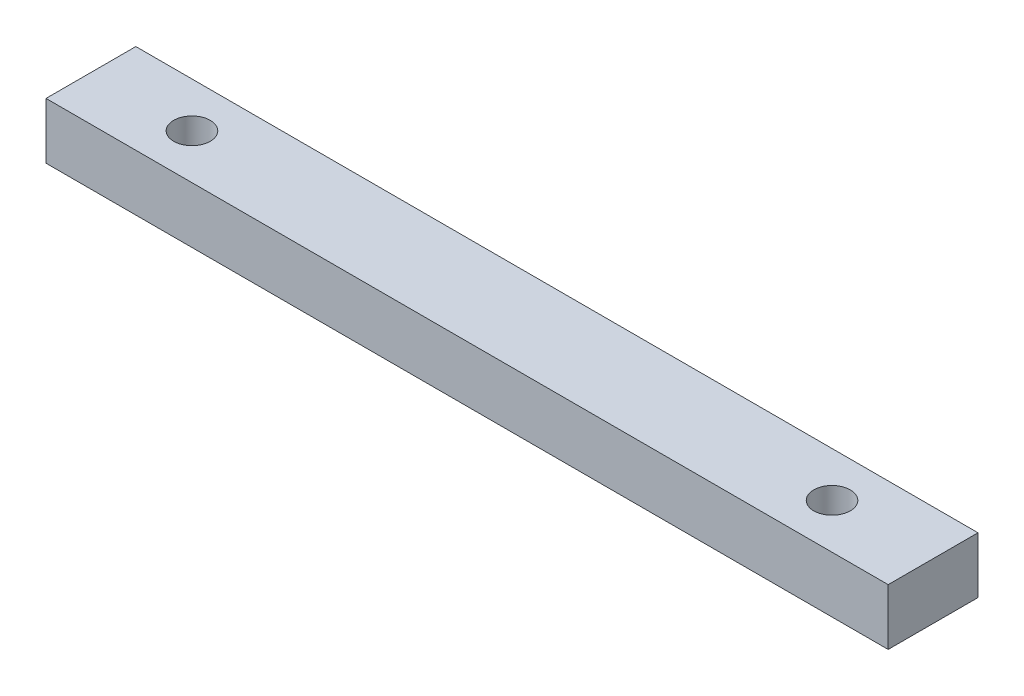
ISO-10303-21;
HEADER;
FILE_DESCRIPTION(('STEP AP214'),'2;1');
FILE_NAME('part.step','',(''),(''),'','','');
FILE_SCHEMA(('AUTOMOTIVE_DESIGN { 1 0 10303 214 1 1 1 1 }'));
ENDSEC;
DATA;
#1=APPLICATION_CONTEXT('core data for automotive mechanical design processes');
#2=APPLICATION_PROTOCOL_DEFINITION('international standard','automotive_design',2000,#1);
#3=PRODUCT_CONTEXT('',#1,'mechanical');
#4=PRODUCT('Part','Part','',(#3));
#5=PRODUCT_RELATED_PRODUCT_CATEGORY('part','',(#4));
#6=PRODUCT_DEFINITION_FORMATION('','',#4);
#7=PRODUCT_DEFINITION_CONTEXT('part definition',#1,'design');
#8=PRODUCT_DEFINITION('design','',#6,#7);
#9=PRODUCT_DEFINITION_SHAPE('','',#8);
#10=(LENGTH_UNIT() NAMED_UNIT(*) SI_UNIT(.MILLI.,.METRE.));
#11=(NAMED_UNIT(*) PLANE_ANGLE_UNIT() SI_UNIT($,.RADIAN.));
#12=(NAMED_UNIT(*) SI_UNIT($,.STERADIAN.) SOLID_ANGLE_UNIT());
#13=UNCERTAINTY_MEASURE_WITH_UNIT(LENGTH_MEASURE(1.E-05),#10,'distance_accuracy_value','');
#14=(GEOMETRIC_REPRESENTATION_CONTEXT(3) GLOBAL_UNCERTAINTY_ASSIGNED_CONTEXT((#13)) GLOBAL_UNIT_ASSIGNED_CONTEXT((#10,
#11,#12)) REPRESENTATION_CONTEXT('',''));
#15=CARTESIAN_POINT('',(0.,0.,0.));
#16=DIRECTION('',(0.,0.,1.));
#17=DIRECTION('',(1.,0.,0.));
#18=AXIS2_PLACEMENT_3D('',#15,#16,#17);
#19=CARTESIAN_POINT('',(-75.,10.,8.));
#20=DIRECTION('',(1.,0.,0.));
#21=DIRECTION('',(0.,0.,-1.));
#22=AXIS2_PLACEMENT_3D('',#19,#20,#21);
#23=PLANE('',#22);
#24=DIRECTION('',(0.,0.,1.));
#25=VECTOR('',#24,1.);
#26=CARTESIAN_POINT('',(-75.,0.,8.));
#27=LINE('',#26,#25);
#28=CARTESIAN_POINT('',(-75.,0.,-8.));
#29=VERTEX_POINT('',#28);
#30=CARTESIAN_POINT('',(-75.,0.,8.));
#31=VERTEX_POINT('',#30);
#32=EDGE_CURVE('E96',#29,#31,#27,.T.);
#33=ORIENTED_EDGE('',*,*,#32,.T.);
#34=DIRECTION('',(0.,-1.,0.));
#35=VECTOR('',#34,1.);
#36=CARTESIAN_POINT('',(-75.,10.,8.));
#37=LINE('',#36,#35);
#38=CARTESIAN_POINT('',(-75.,10.,8.));
#39=VERTEX_POINT('',#38);
#40=EDGE_CURVE('E11',#39,#31,#37,.T.);
#41=ORIENTED_EDGE('',*,*,#40,.F.);
#42=DIRECTION('',(0.,0.,1.));
#43=VECTOR('',#42,1.);
#44=CARTESIAN_POINT('',(-75.,10.,8.));
#45=LINE('',#44,#43);
#46=CARTESIAN_POINT('',(-75.,10.,-8.));
#47=VERTEX_POINT('',#46);
#48=EDGE_CURVE('E84',#47,#39,#45,.T.);
#49=ORIENTED_EDGE('',*,*,#48,.F.);
#50=DIRECTION('',(0.,-1.,0.));
#51=VECTOR('',#50,1.);
#52=CARTESIAN_POINT('',(-75.,10.,-8.));
#53=LINE('',#52,#51);
#54=EDGE_CURVE('E92',#47,#29,#53,.T.);
#55=ORIENTED_EDGE('',*,*,#54,.T.);
#56=EDGE_LOOP('',(#33,#41,#49,#55));
#57=FACE_BOUND('',#56,.T.);
#58=ADVANCED_FACE('F33',(#57),#23,.F.);
#59=CARTESIAN_POINT('',(-75.,10.,8.));
#60=DIRECTION('',(0.,0.,-1.));
#61=DIRECTION('',(-1.,0.,0.));
#62=AXIS2_PLACEMENT_3D('',#59,#60,#61);
#63=PLANE('',#62);
#64=DIRECTION('',(1.,0.,0.));
#65=VECTOR('',#64,1.);
#66=CARTESIAN_POINT('',(-75.,0.,8.));
#67=LINE('',#66,#65);
#68=CARTESIAN_POINT('',(75.,0.,8.));
#69=VERTEX_POINT('',#68);
#70=EDGE_CURVE('E88',#31,#69,#67,.T.);
#71=ORIENTED_EDGE('',*,*,#70,.T.);
#72=DIRECTION('',(0.,-1.,0.));
#73=VECTOR('',#72,1.);
#74=CARTESIAN_POINT('',(75.,10.,8.));
#75=LINE('',#74,#73);
#76=CARTESIAN_POINT('',(75.,10.,8.));
#77=VERTEX_POINT('',#76);
#78=EDGE_CURVE('E41',#77,#69,#75,.T.);
#79=ORIENTED_EDGE('',*,*,#78,.F.);
#80=DIRECTION('',(1.,0.,0.));
#81=VECTOR('',#80,1.);
#82=CARTESIAN_POINT('',(-75.,10.,8.));
#83=LINE('',#82,#81);
#84=EDGE_CURVE('E79',#39,#77,#83,.T.);
#85=ORIENTED_EDGE('',*,*,#84,.F.);
#86=ORIENTED_EDGE('',*,*,#40,.T.);
#87=EDGE_LOOP('',(#71,#79,#85,#86));
#88=FACE_BOUND('',#87,.T.);
#89=ADVANCED_FACE('F87',(#88),#63,.F.);
#90=CARTESIAN_POINT('',(75.,10.,8.));
#91=DIRECTION('',(-1.,0.,0.));
#92=DIRECTION('',(0.,0.,1.));
#93=AXIS2_PLACEMENT_3D('',#90,#91,#92);
#94=PLANE('',#93);
#95=DIRECTION('',(0.,0.,-1.));
#96=VECTOR('',#95,1.);
#97=CARTESIAN_POINT('',(75.,0.,8.));
#98=LINE('',#97,#96);
#99=CARTESIAN_POINT('',(75.,0.,-8.));
#100=VERTEX_POINT('',#99);
#101=EDGE_CURVE('E66',#69,#100,#98,.T.);
#102=ORIENTED_EDGE('',*,*,#101,.T.);
#103=DIRECTION('',(0.,-1.,0.));
#104=VECTOR('',#103,1.);
#105=CARTESIAN_POINT('',(75.,10.,-8.));
#106=LINE('',#105,#104);
#107=CARTESIAN_POINT('',(75.,10.,-8.));
#108=VERTEX_POINT('',#107);
#109=EDGE_CURVE('E89',#108,#100,#106,.T.);
#110=ORIENTED_EDGE('',*,*,#109,.F.);
#111=DIRECTION('',(0.,0.,-1.));
#112=VECTOR('',#111,1.);
#113=CARTESIAN_POINT('',(75.,10.,8.));
#114=LINE('',#113,#112);
#115=EDGE_CURVE('E82',#77,#108,#114,.T.);
#116=ORIENTED_EDGE('',*,*,#115,.F.);
#117=ORIENTED_EDGE('',*,*,#78,.T.);
#118=EDGE_LOOP('',(#102,#110,#116,#117));
#119=FACE_BOUND('',#118,.T.);
#120=ADVANCED_FACE('F90',(#119),#94,.F.);
#121=CARTESIAN_POINT('',(-75.,10.,-8.));
#122=DIRECTION('',(0.,0.,1.));
#123=DIRECTION('',(1.,0.,0.));
#124=AXIS2_PLACEMENT_3D('',#121,#122,#123);
#125=PLANE('',#124);
#126=DIRECTION('',(-1.,0.,0.));
#127=VECTOR('',#126,1.);
#128=CARTESIAN_POINT('',(-75.,0.,-8.));
#129=LINE('',#128,#127);
#130=EDGE_CURVE('E72',#100,#29,#129,.T.);
#131=ORIENTED_EDGE('',*,*,#130,.T.);
#132=ORIENTED_EDGE('',*,*,#54,.F.);
#133=DIRECTION('',(-1.,0.,0.));
#134=VECTOR('',#133,1.);
#135=CARTESIAN_POINT('',(-75.,10.,-8.));
#136=LINE('',#135,#134);
#137=EDGE_CURVE('E49',#108,#47,#136,.T.);
#138=ORIENTED_EDGE('',*,*,#137,.F.);
#139=ORIENTED_EDGE('',*,*,#109,.T.);
#140=EDGE_LOOP('',(#131,#132,#138,#139));
#141=FACE_BOUND('',#140,.T.);
#142=ADVANCED_FACE('F104',(#141),#125,.F.);
#143=CARTESIAN_POINT('',(-75.,10.,-8.));
#144=DIRECTION('',(0.,-1.,0.));
#145=DIRECTION('',(0.,0.,-1.));
#146=AXIS2_PLACEMENT_3D('',#143,#144,#145);
#147=PLANE('',#146);
#148=CARTESIAN_POINT('',(57.,10.,0.));
#149=DIRECTION('',(0.,1.,0.));
#150=DIRECTION('',(0.,0.,-1.));
#151=AXIS2_PLACEMENT_3D('',#148,#149,#150);
#152=CIRCLE('',#151,3.25000000000001);
#153=CARTESIAN_POINT('',(57.,10.,-3.25000000000001));
#154=VERTEX_POINT('',#153);
#155=EDGE_CURVE('E113',#154,#154,#152,.T.);
#156=ORIENTED_EDGE('',*,*,#155,.F.);
#157=EDGE_LOOP('',(#156));
#158=FACE_BOUND('',#157,.T.);
#159=CARTESIAN_POINT('',(-57.,10.,0.));
#160=DIRECTION('',(0.,1.,0.));
#161=DIRECTION('',(0.,0.,1.));
#162=AXIS2_PLACEMENT_3D('',#159,#160,#161);
#163=CIRCLE('',#162,3.25000000000001);
#164=CARTESIAN_POINT('',(-57.,10.,3.25000000000001));
#165=VERTEX_POINT('',#164);
#166=EDGE_CURVE('E99',#165,#165,#163,.T.);
#167=ORIENTED_EDGE('',*,*,#166,.F.);
#168=EDGE_LOOP('',(#167));
#169=FACE_BOUND('',#168,.T.);
#170=ORIENTED_EDGE('',*,*,#48,.T.);
#171=ORIENTED_EDGE('',*,*,#84,.T.);
#172=ORIENTED_EDGE('',*,*,#115,.T.);
#173=ORIENTED_EDGE('',*,*,#137,.T.);
#174=EDGE_LOOP('',(#170,#171,#172,#173));
#175=FACE_BOUND('',#174,.T.);
#176=ADVANCED_FACE('F80',(#158,#169,#175),#147,.F.);
#177=CARTESIAN_POINT('',(-75.,0.,-8.));
#178=DIRECTION('',(0.,-1.,0.));
#179=DIRECTION('',(0.,0.,-1.));
#180=AXIS2_PLACEMENT_3D('',#177,#178,#179);
#181=PLANE('',#180);
#182=CARTESIAN_POINT('',(57.,0.,0.));
#183=DIRECTION('',(0.,-1.,0.));
#184=DIRECTION('',(0.,0.,-1.));
#185=AXIS2_PLACEMENT_3D('',#182,#183,#184);
#186=CIRCLE('',#185,3.25000000000001);
#187=CARTESIAN_POINT('',(57.,0.,-3.25000000000001));
#188=VERTEX_POINT('',#187);
#189=EDGE_CURVE('E116',#188,#188,#186,.F.);
#190=ORIENTED_EDGE('',*,*,#189,.T.);
#191=EDGE_LOOP('',(#190));
#192=FACE_BOUND('',#191,.T.);
#193=CARTESIAN_POINT('',(-57.,0.,0.));
#194=DIRECTION('',(0.,-1.,0.));
#195=DIRECTION('',(0.,0.,-1.));
#196=AXIS2_PLACEMENT_3D('',#193,#194,#195);
#197=CIRCLE('',#196,3.25000000000001);
#198=CARTESIAN_POINT('',(-57.,0.,-3.25000000000001));
#199=VERTEX_POINT('',#198);
#200=EDGE_CURVE('E110',#199,#199,#197,.F.);
#201=ORIENTED_EDGE('',*,*,#200,.T.);
#202=EDGE_LOOP('',(#201));
#203=FACE_BOUND('',#202,.T.);
#204=ORIENTED_EDGE('',*,*,#32,.F.);
#205=ORIENTED_EDGE('',*,*,#130,.F.);
#206=ORIENTED_EDGE('',*,*,#101,.F.);
#207=ORIENTED_EDGE('',*,*,#70,.F.);
#208=EDGE_LOOP('',(#204,#205,#206,#207));
#209=FACE_BOUND('',#208,.T.);
#210=ADVANCED_FACE('F107',(#192,#203,#209),#181,.T.);
#211=CARTESIAN_POINT('',(-57.,-0.000999999999999265,0.));
#212=DIRECTION('',(0.,1.,0.));
#213=DIRECTION('',(0.,0.,1.));
#214=AXIS2_PLACEMENT_3D('',#211,#212,#213);
#215=CYLINDRICAL_SURFACE('',#214,3.25000000000001);
#216=ORIENTED_EDGE('',*,*,#200,.F.);
#217=EDGE_LOOP('',(#216));
#218=FACE_BOUND('',#217,.T.);
#219=ORIENTED_EDGE('',*,*,#166,.T.);
#220=EDGE_LOOP('',(#219));
#221=FACE_BOUND('',#220,.T.);
#222=ADVANCED_FACE('F129',(#218,#221),#215,.F.);
#223=CARTESIAN_POINT('',(57.,-0.000999999999999265,0.));
#224=DIRECTION('',(0.,1.,0.));
#225=DIRECTION('',(0.,0.,1.));
#226=AXIS2_PLACEMENT_3D('',#223,#224,#225);
#227=CYLINDRICAL_SURFACE('',#226,3.25000000000001);
#228=ORIENTED_EDGE('',*,*,#189,.F.);
#229=EDGE_LOOP('',(#228));
#230=FACE_BOUND('',#229,.T.);
#231=ORIENTED_EDGE('',*,*,#155,.T.);
#232=EDGE_LOOP('',(#231));
#233=FACE_BOUND('',#232,.T.);
#234=ADVANCED_FACE('F122',(#230,#233),#227,.F.);
#235=CLOSED_SHELL('',(#58,#89,#120,#142,#176,#210,#222,#234));
#236=MANIFOLD_SOLID_BREP('B2',#235);
#237=ADVANCED_BREP_SHAPE_REPRESENTATION('',(#18,#236),#14);
#238=SHAPE_DEFINITION_REPRESENTATION(#9,#237);
ENDSEC;
END-ISO-10303-21;
